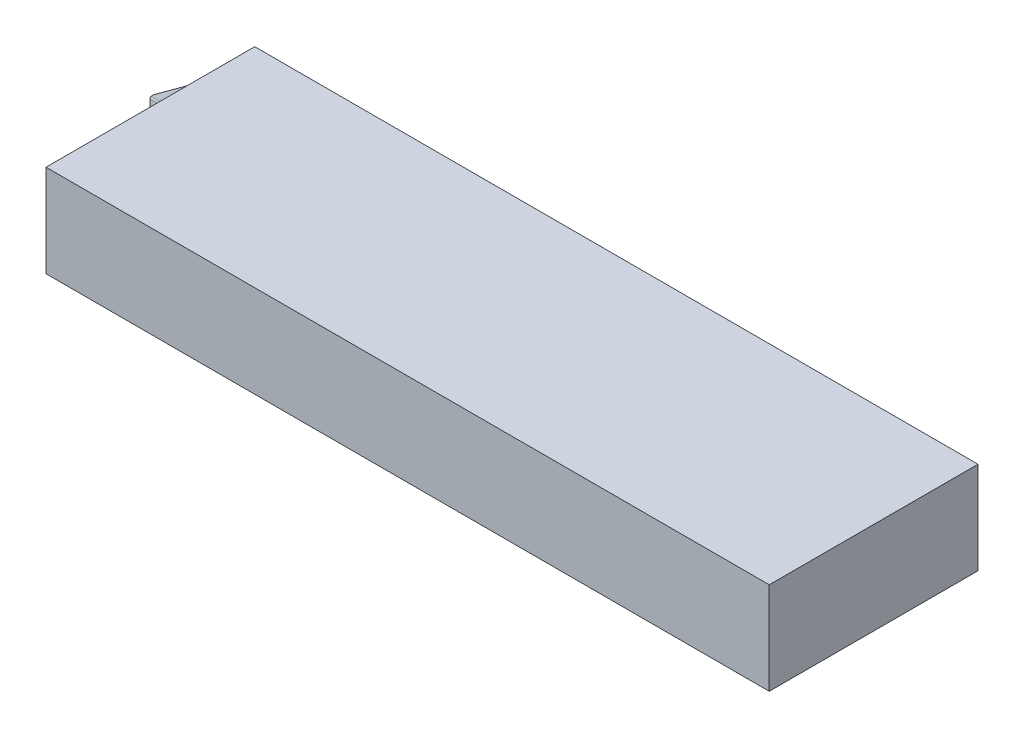
ISO-10303-21;
HEADER;
FILE_DESCRIPTION(('STEP AP214'),'2;1');
FILE_NAME('part.step','',(''),(''),'','','');
FILE_SCHEMA(('AUTOMOTIVE_DESIGN { 1 0 10303 214 1 1 1 1 }'));
ENDSEC;
DATA;
#1=APPLICATION_CONTEXT('core data for automotive mechanical design processes');
#2=APPLICATION_PROTOCOL_DEFINITION('international standard','automotive_design',2000,#1);
#3=PRODUCT_CONTEXT('',#1,'mechanical');
#4=PRODUCT('Part','Part','',(#3));
#5=PRODUCT_RELATED_PRODUCT_CATEGORY('part','',(#4));
#6=PRODUCT_DEFINITION_FORMATION('','',#4);
#7=PRODUCT_DEFINITION_CONTEXT('part definition',#1,'design');
#8=PRODUCT_DEFINITION('design','',#6,#7);
#9=PRODUCT_DEFINITION_SHAPE('','',#8);
#10=(LENGTH_UNIT() NAMED_UNIT(*) SI_UNIT(.MILLI.,.METRE.));
#11=(NAMED_UNIT(*) PLANE_ANGLE_UNIT() SI_UNIT($,.RADIAN.));
#12=(NAMED_UNIT(*) SI_UNIT($,.STERADIAN.) SOLID_ANGLE_UNIT());
#13=UNCERTAINTY_MEASURE_WITH_UNIT(LENGTH_MEASURE(1.E-05),#10,'distance_accuracy_value','');
#14=(GEOMETRIC_REPRESENTATION_CONTEXT(3) GLOBAL_UNCERTAINTY_ASSIGNED_CONTEXT((#13)) GLOBAL_UNIT_ASSIGNED_CONTEXT((#10,
#11,#12)) REPRESENTATION_CONTEXT('',''));
#15=CARTESIAN_POINT('',(0.,0.,0.));
#16=DIRECTION('',(0.,0.,1.));
#17=DIRECTION('',(1.,0.,0.));
#18=AXIS2_PLACEMENT_3D('',#15,#16,#17);
#19=CARTESIAN_POINT('',(-11.,2.8067,-3.175));
#20=DIRECTION('',(1.,0.,0.));
#21=DIRECTION('',(0.,0.,-1.));
#22=AXIS2_PLACEMENT_3D('',#19,#20,#21);
#23=PLANE('',#22);
#24=DIRECTION('',(0.,-1.,0.));
#25=VECTOR('',#24,1.);
#26=CARTESIAN_POINT('',(-11.,1.51822012820513,-0.427690934701181));
#27=LINE('',#26,#25);
#28=CARTESIAN_POINT('',(-11.,2.58602775294961,-0.427690934701183));
#29=VERTEX_POINT('',#28);
#30=CARTESIAN_POINT('',(-11.,2.12708191610956,-0.427690934701182));
#31=VERTEX_POINT('',#30);
#32=EDGE_CURVE('E237',#29,#31,#27,.T.);
#33=ORIENTED_EDGE('',*,*,#32,.T.);
#34=CARTESIAN_POINT('',(-11.,2.14140290911485,-0.370406962680024));
#35=DIRECTION('',(1.,0.,0.));
#36=DIRECTION('',(0.,0.707106781186549,0.707106781186546));
#37=AXIS2_PLACEMENT_3D('',#34,#35,#36);
#38=ELLIPSE('',#37,0.0640454277302532,0.049609375);
#39=CARTESIAN_POINT('',(-11.,2.08411893709369,-0.384727955685313));
#40=VERTEX_POINT('',#39);
#41=EDGE_CURVE('E239',#31,#40,#38,.F.);
#42=ORIENTED_EDGE('',*,*,#41,.T.);
#43=DIRECTION('',(0.,0.,1.));
#44=VECTOR('',#43,1.);
#45=CARTESIAN_POINT('',(-11.,2.08411893709369,1.25));
#46=LINE('',#45,#44);
#47=CARTESIAN_POINT('',(-11.,2.08411893709369,1.77293582987269));
#48=VERTEX_POINT('',#47);
#49=EDGE_CURVE('E461',#40,#48,#46,.T.);
#50=ORIENTED_EDGE('',*,*,#49,.T.);
#51=CARTESIAN_POINT('',(-11.,2.02683496507253,1.7586148368674));
#52=DIRECTION('',(1.,0.,0.));
#53=DIRECTION('',(0.,-0.707106781186548,-0.707106781186547));
#54=AXIS2_PLACEMENT_3D('',#51,#52,#53);
#55=ELLIPSE('',#54,0.0640454277302532,0.049609375);
#56=CARTESIAN_POINT('',(-11.,2.04115595807782,1.81589880888856));
#57=VERTEX_POINT('',#56);
#58=EDGE_CURVE('E221',#48,#57,#55,.T.);
#59=ORIENTED_EDGE('',*,*,#58,.T.);
#60=DIRECTION('',(0.,-1.,0.));
#61=VECTOR('',#60,1.);
#62=CARTESIAN_POINT('',(-11.,1.29386115384615,1.81589880888856));
#63=LINE('',#62,#61);
#64=CARTESIAN_POINT('',(-11.,0.77092532397346,1.81589880888856));
#65=VERTEX_POINT('',#64);
#66=EDGE_CURVE('E191',#57,#65,#63,.T.);
#67=ORIENTED_EDGE('',*,*,#66,.T.);
#68=CARTESIAN_POINT('',(-11.,0.78524631697875,1.75861483686741));
#69=DIRECTION('',(1.,0.,0.));
#70=DIRECTION('',(0.,-0.707106781186547,0.707106781186549));
#71=AXIS2_PLACEMENT_3D('',#68,#69,#70);
#72=ELLIPSE('',#71,0.0640454277302532,0.049609375);
#73=CARTESIAN_POINT('',(-11.,0.727962344957592,1.7729358298727));
#74=VERTEX_POINT('',#73);
#75=EDGE_CURVE('E219',#65,#74,#72,.T.);
#76=ORIENTED_EDGE('',*,*,#75,.T.);
#77=DIRECTION('',(0.,0.,-1.));
#78=VECTOR('',#77,1.);
#79=CARTESIAN_POINT('',(-11.,0.72796234495759,-0.993589743589744));
#80=LINE('',#79,#78);
#81=CARTESIAN_POINT('',(-11.,0.72796234495759,-0.384727955685313));
#82=VERTEX_POINT('',#81);
#83=EDGE_CURVE('E269',#74,#82,#80,.T.);
#84=ORIENTED_EDGE('',*,*,#83,.T.);
#85=CARTESIAN_POINT('',(-11.,0.670678372936433,-0.370406962680024));
#86=DIRECTION('',(1.,0.,0.));
#87=DIRECTION('',(0.,0.707106781186547,-0.707106781186548));
#88=AXIS2_PLACEMENT_3D('',#85,#86,#87);
#89=ELLIPSE('',#88,0.0640454277302532,0.049609375);
#90=CARTESIAN_POINT('',(-11.,0.684999365941722,-0.427690934701181));
#91=VERTEX_POINT('',#90);
#92=EDGE_CURVE('E243',#82,#91,#89,.F.);
#93=ORIENTED_EDGE('',*,*,#92,.T.);
#94=DIRECTION('',(0.,-1.,0.));
#95=VECTOR('',#94,1.);
#96=CARTESIAN_POINT('',(-11.,0.748989358974357,-0.427690934701181));
#97=LINE('',#96,#95);
#98=CARTESIAN_POINT('',(-11.,0.226053529101663,-0.427690934701181));
#99=VERTEX_POINT('',#98);
#100=EDGE_CURVE('E441',#91,#99,#97,.T.);
#101=ORIENTED_EDGE('',*,*,#100,.T.);
#102=CARTESIAN_POINT('',(-11.,0.240374522106953,-0.484974906722339));
#103=DIRECTION('',(1.,0.,0.));
#104=DIRECTION('',(0.,-0.707106781186548,0.707106781186548));
#105=AXIS2_PLACEMENT_3D('',#102,#103,#104);
#106=ELLIPSE('',#105,0.0640454277302532,0.049609375);
#107=CARTESIAN_POINT('',(-11.,0.183090550085795,-0.470653913717049));
#108=VERTEX_POINT('',#107);
#109=EDGE_CURVE('E217',#99,#108,#106,.T.);
#110=ORIENTED_EDGE('',*,*,#109,.T.);
#111=DIRECTION('',(0.,0.,-1.));
#112=VECTOR('',#111,1.);
#113=CARTESIAN_POINT('',(-11.,0.183090550085796,-1.25));
#114=LINE('',#113,#112);
#115=CARTESIAN_POINT('',(-11.,0.183090550085796,-1.77293582987269));
#116=VERTEX_POINT('',#115);
#117=EDGE_CURVE('E446',#108,#116,#114,.T.);
#118=ORIENTED_EDGE('',*,*,#117,.T.);
#119=CARTESIAN_POINT('',(-11.,0.240374522106954,-1.7586148368674));
#120=DIRECTION('',(1.,0.,0.));
#121=DIRECTION('',(0.,-0.707106781186547,-0.707106781186548));
#122=AXIS2_PLACEMENT_3D('',#119,#120,#121);
#123=ELLIPSE('',#122,0.0640454277302532,0.049609375);
#124=CARTESIAN_POINT('',(-11.,0.226053529101664,-1.81589880888856));
#125=VERTEX_POINT('',#124);
#126=EDGE_CURVE('E215',#116,#125,#123,.T.);
#127=ORIENTED_EDGE('',*,*,#126,.T.);
#128=DIRECTION('',(0.,1.,0.));
#129=VECTOR('',#128,1.);
#130=CARTESIAN_POINT('',(-11.,2.06309192307692,-1.81589880888856));
#131=LINE('',#130,#129);
#132=CARTESIAN_POINT('',(-11.,2.58602775294961,-1.81589880888856));
#133=VERTEX_POINT('',#132);
#134=EDGE_CURVE('E230',#125,#133,#131,.T.);
#135=ORIENTED_EDGE('',*,*,#134,.T.);
#136=CARTESIAN_POINT('',(-11.,2.57170675994433,-1.75861483686741));
#137=DIRECTION('',(1.,0.,0.));
#138=DIRECTION('',(0.,-0.707106781186547,0.707106781186548));
#139=AXIS2_PLACEMENT_3D('',#136,#137,#138);
#140=ELLIPSE('',#139,0.0640454277302532,0.049609375);
#141=CARTESIAN_POINT('',(-11.,2.62899073196548,-1.77293582987269));
#142=VERTEX_POINT('',#141);
#143=EDGE_CURVE('E52',#133,#142,#140,.T.);
#144=ORIENTED_EDGE('',*,*,#143,.T.);
#145=DIRECTION('',(0.,0.,1.));
#146=VECTOR('',#145,1.);
#147=CARTESIAN_POINT('',(-11.,2.62899073196548,-0.993589743589744));
#148=LINE('',#147,#146);
#149=CARTESIAN_POINT('',(-11.,2.62899073196548,-0.470653913717051));
#150=VERTEX_POINT('',#149);
#151=EDGE_CURVE('E227',#142,#150,#148,.T.);
#152=ORIENTED_EDGE('',*,*,#151,.T.);
#153=CARTESIAN_POINT('',(-11.,2.57170675994433,-0.484974906722341));
#154=DIRECTION('',(1.,0.,0.));
#155=DIRECTION('',(0.,-0.707106781186548,-0.707106781186547));
#156=AXIS2_PLACEMENT_3D('',#153,#154,#155);
#157=ELLIPSE('',#156,0.0640454277302532,0.049609375);
#158=EDGE_CURVE('E208',#150,#29,#157,.T.);
#159=ORIENTED_EDGE('',*,*,#158,.T.);
#160=EDGE_LOOP('',(#33,#42,#50,#59,#67,#76,#84,#93,#101,#110,#118,#127,#135,#144,#152,#159));
#161=FACE_BOUND('',#160,.T.);
#162=DIRECTION('',(0.,0.,1.));
#163=VECTOR('',#162,1.);
#164=CARTESIAN_POINT('',(-11.,0.,-3.175));
#165=LINE('',#164,#163);
#166=CARTESIAN_POINT('',(-11.,0.,-3.175));
#167=VERTEX_POINT('',#166);
#168=CARTESIAN_POINT('',(-11.,0.,3.175));
#169=VERTEX_POINT('',#168);
#170=EDGE_CURVE('E494',#167,#169,#165,.T.);
#171=ORIENTED_EDGE('',*,*,#170,.T.);
#172=DIRECTION('',(0.,-1.,0.));
#173=VECTOR('',#172,1.);
#174=CARTESIAN_POINT('',(-11.,2.8067,3.175));
#175=LINE('',#174,#173);
#176=CARTESIAN_POINT('',(-11.,2.8067,3.175));
#177=VERTEX_POINT('',#176);
#178=EDGE_CURVE('E499',#177,#169,#175,.T.);
#179=ORIENTED_EDGE('',*,*,#178,.F.);
#180=DIRECTION('',(0.,0.,1.));
#181=VECTOR('',#180,1.);
#182=CARTESIAN_POINT('',(-11.,2.8067,-3.175));
#183=LINE('',#182,#181);
#184=CARTESIAN_POINT('',(-11.,2.8067,-3.175));
#185=VERTEX_POINT('',#184);
#186=EDGE_CURVE('E488',#185,#177,#183,.T.);
#187=ORIENTED_EDGE('',*,*,#186,.F.);
#188=DIRECTION('',(0.,-1.,0.));
#189=VECTOR('',#188,1.);
#190=CARTESIAN_POINT('',(-11.,2.8067,-3.175));
#191=LINE('',#190,#189);
#192=EDGE_CURVE('E502',#185,#167,#191,.T.);
#193=ORIENTED_EDGE('',*,*,#192,.T.);
#194=EDGE_LOOP('',(#171,#179,#187,#193));
#195=FACE_BOUND('',#194,.T.);
#196=ADVANCED_FACE('F38',(#161,#195),#23,.F.);
#197=CARTESIAN_POINT('',(11.,2.8067,-3.175));
#198=DIRECTION('',(-1.,0.,0.));
#199=DIRECTION('',(0.,0.,1.));
#200=AXIS2_PLACEMENT_3D('',#197,#198,#199);
#201=PLANE('',#200);
#202=DIRECTION('',(0.,0.,-1.));
#203=VECTOR('',#202,1.);
#204=CARTESIAN_POINT('',(11.,0.,-3.175));
#205=LINE('',#204,#203);
#206=CARTESIAN_POINT('',(11.,0.,3.175));
#207=VERTEX_POINT('',#206);
#208=CARTESIAN_POINT('',(11.,0.,-3.175));
#209=VERTEX_POINT('',#208);
#210=EDGE_CURVE('E473',#207,#209,#205,.T.);
#211=ORIENTED_EDGE('',*,*,#210,.T.);
#212=DIRECTION('',(0.,-1.,0.));
#213=VECTOR('',#212,1.);
#214=CARTESIAN_POINT('',(11.,2.8067,-3.175));
#215=LINE('',#214,#213);
#216=CARTESIAN_POINT('',(11.,2.8067,-3.175));
#217=VERTEX_POINT('',#216);
#218=EDGE_CURVE('E505',#217,#209,#215,.T.);
#219=ORIENTED_EDGE('',*,*,#218,.F.);
#220=DIRECTION('',(0.,0.,-1.));
#221=VECTOR('',#220,1.);
#222=CARTESIAN_POINT('',(11.,2.8067,-3.175));
#223=LINE('',#222,#221);
#224=CARTESIAN_POINT('',(11.,2.8067,3.175));
#225=VERTEX_POINT('',#224);
#226=EDGE_CURVE('E482',#225,#217,#223,.T.);
#227=ORIENTED_EDGE('',*,*,#226,.F.);
#228=DIRECTION('',(0.,-1.,0.));
#229=VECTOR('',#228,1.);
#230=CARTESIAN_POINT('',(11.,2.8067,3.175));
#231=LINE('',#230,#229);
#232=EDGE_CURVE('E491',#225,#207,#231,.T.);
#233=ORIENTED_EDGE('',*,*,#232,.T.);
#234=EDGE_LOOP('',(#211,#219,#227,#233));
#235=FACE_BOUND('',#234,.T.);
#236=ADVANCED_FACE('F347',(#235),#201,.F.);
#237=CARTESIAN_POINT('',(11.,2.8067,-3.175));
#238=DIRECTION('',(0.,0.,1.));
#239=DIRECTION('',(1.,0.,0.));
#240=AXIS2_PLACEMENT_3D('',#237,#238,#239);
#241=PLANE('',#240);
#242=DIRECTION('',(-1.,0.,0.));
#243=VECTOR('',#242,1.);
#244=CARTESIAN_POINT('',(11.,0.,-3.175));
#245=LINE('',#244,#243);
#246=EDGE_CURVE('E475',#209,#167,#245,.T.);
#247=ORIENTED_EDGE('',*,*,#246,.T.);
#248=ORIENTED_EDGE('',*,*,#192,.F.);
#249=DIRECTION('',(-1.,0.,0.));
#250=VECTOR('',#249,1.);
#251=CARTESIAN_POINT('',(11.,2.8067,-3.175));
#252=LINE('',#251,#250);
#253=EDGE_CURVE('E485',#217,#185,#252,.T.);
#254=ORIENTED_EDGE('',*,*,#253,.F.);
#255=ORIENTED_EDGE('',*,*,#218,.T.);
#256=EDGE_LOOP('',(#247,#248,#254,#255));
#257=FACE_BOUND('',#256,.T.);
#258=ADVANCED_FACE('F352',(#257),#241,.F.);
#259=CARTESIAN_POINT('',(11.,2.8067,3.175));
#260=DIRECTION('',(0.,0.,-1.));
#261=DIRECTION('',(-1.,0.,0.));
#262=AXIS2_PLACEMENT_3D('',#259,#260,#261);
#263=PLANE('',#262);
#264=DIRECTION('',(1.,0.,0.));
#265=VECTOR('',#264,1.);
#266=CARTESIAN_POINT('',(11.,0.,3.175));
#267=LINE('',#266,#265);
#268=EDGE_CURVE('E486',#169,#207,#267,.T.);
#269=ORIENTED_EDGE('',*,*,#268,.T.);
#270=ORIENTED_EDGE('',*,*,#232,.F.);
#271=DIRECTION('',(1.,0.,0.));
#272=VECTOR('',#271,1.);
#273=CARTESIAN_POINT('',(11.,2.8067,3.175));
#274=LINE('',#273,#272);
#275=EDGE_CURVE('E490',#177,#225,#274,.T.);
#276=ORIENTED_EDGE('',*,*,#275,.F.);
#277=ORIENTED_EDGE('',*,*,#178,.T.);
#278=EDGE_LOOP('',(#269,#270,#276,#277));
#279=FACE_BOUND('',#278,.T.);
#280=ADVANCED_FACE('F357',(#279),#263,.F.);
#281=CARTESIAN_POINT('',(0.,2.8067,0.));
#282=DIRECTION('',(0.,-1.,0.));
#283=DIRECTION('',(0.,0.,-1.));
#284=AXIS2_PLACEMENT_3D('',#281,#282,#283);
#285=PLANE('',#284);
#286=ORIENTED_EDGE('',*,*,#226,.T.);
#287=ORIENTED_EDGE('',*,*,#253,.T.);
#288=ORIENTED_EDGE('',*,*,#186,.T.);
#289=ORIENTED_EDGE('',*,*,#275,.T.);
#290=EDGE_LOOP('',(#286,#287,#288,#289));
#291=FACE_BOUND('',#290,.T.);
#292=ADVANCED_FACE('F291',(#291),#285,.F.);
#293=CARTESIAN_POINT('',(0.,0.,0.));
#294=DIRECTION('',(0.,-1.,0.));
#295=DIRECTION('',(0.,0.,-1.));
#296=AXIS2_PLACEMENT_3D('',#293,#294,#295);
#297=PLANE('',#296);
#298=ORIENTED_EDGE('',*,*,#210,.F.);
#299=ORIENTED_EDGE('',*,*,#268,.F.);
#300=ORIENTED_EDGE('',*,*,#170,.F.);
#301=ORIENTED_EDGE('',*,*,#246,.F.);
#302=EDGE_LOOP('',(#298,#299,#300,#301));
#303=FACE_BOUND('',#302,.T.);
#304=ADVANCED_FACE('F410',(#303),#297,.T.);
#305=CARTESIAN_POINT('',(-12.0780205827676,2.06309192307692,-1.19350333523574));
#306=DIRECTION('',(0.500000000000005,0.,0.866025403784436));
#307=DIRECTION('',(0.,-1.,0.));
#308=AXIS2_PLACEMENT_3D('',#305,#306,#307);
#309=PLANE('',#308);
#310=ORIENTED_EDGE('',*,*,#134,.F.);
#311=DIRECTION('',(0.774596669241479,-0.447213595499961,-0.447213595499962));
#312=VECTOR('',#311,1.);
#313=CARTESIAN_POINT('',(-12.498785232978,1.09137758681898,-0.95057475117125));
#314=LINE('',#313,#312);
#315=CARTESIAN_POINT('',(-12.07696,0.847836675008121,-1.1941156629821));
#316=VERTEX_POINT('',#315);
#317=EDGE_CURVE('E253',#125,#316,#314,.F.);
#318=ORIENTED_EDGE('',*,*,#317,.T.);
#319=DIRECTION('',(0.,-1.,0.));
#320=VECTOR('',#319,1.);
#321=CARTESIAN_POINT('',(-12.07696,2.06309192307692,-1.1941156629821));
#322=LINE('',#321,#320);
#323=CARTESIAN_POINT('',(-12.07696,1.96424460704316,-1.19411566298211));
#324=VERTEX_POINT('',#323);
#325=EDGE_CURVE('E190',#324,#316,#322,.T.);
#326=ORIENTED_EDGE('',*,*,#325,.F.);
#327=DIRECTION('',(-0.774596669241479,-0.447213595499961,0.447213595499962));
#328=VECTOR('',#327,1.);
#329=CARTESIAN_POINT('',(-12.0435667515016,1.98352420805282,-1.21339526399177));
#330=LINE('',#329,#328);
#331=EDGE_CURVE('E251',#324,#133,#330,.F.);
#332=ORIENTED_EDGE('',*,*,#331,.T.);
#333=EDGE_LOOP('',(#310,#318,#326,#332));
#334=FACE_BOUND('',#333,.T.);
#335=ADVANCED_FACE('F405',(#334),#309,.F.);
#336=CARTESIAN_POINT('',(-12.0780205827676,0.805486023738616,-1.25));
#337=DIRECTION('',(0.500000000000005,0.866025403784436,0.));
#338=DIRECTION('',(0.,0.,1.));
#339=AXIS2_PLACEMENT_3D('',#336,#337,#338);
#340=PLANE('',#339);
#341=DIRECTION('',(0.774596669241479,-0.447213595499962,0.447213595499962));
#342=VECTOR('',#341,1.);
#343=CARTESIAN_POINT('',(-12.1323898698385,0.836876146264642,-1.1244395098959));
#344=LINE('',#343,#342);
#345=CARTESIAN_POINT('',(-12.0562747319261,0.792931050901548,-1.0804944145328));
#346=VERTEX_POINT('',#345);
#347=EDGE_CURVE('E241',#108,#346,#344,.F.);
#348=ORIENTED_EDGE('',*,*,#347,.T.);
#349=CARTESIAN_POINT('',(-18.3136728989092,4.40564156703596,0.));
#350=DIRECTION('',(0.500000000000005,0.866025403784436,0.));
#351=DIRECTION('',(0.866025403784436,-0.500000000000005,0.));
#352=AXIS2_PLACEMENT_3D('',#349,#350,#351);
#353=ELLIPSE('',#352,7.33234841870827,6.35);
#354=CARTESIAN_POINT('',(-12.0696651203595,0.800661995268129,-1.15536438469036));
#355=VERTEX_POINT('',#354);
#356=EDGE_CURVE('E330',#346,#355,#353,.T.);
#357=ORIENTED_EDGE('',*,*,#356,.T.);
#358=DIRECTION('',(0.774596669241479,-0.447213595499961,-0.447213595499962));
#359=VECTOR('',#358,1.);
#360=CARTESIAN_POINT('',(-12.0435667515016,0.78559409498259,-1.1704322849759));
#361=LINE('',#360,#359);
#362=EDGE_CURVE('E249',#355,#116,#361,.T.);
#363=ORIENTED_EDGE('',*,*,#362,.T.);
#364=ORIENTED_EDGE('',*,*,#117,.F.);
#365=EDGE_LOOP('',(#348,#357,#363,#364));
#366=FACE_BOUND('',#365,.T.);
#367=ADVANCED_FACE('F399',(#366),#340,.F.);
#368=CARTESIAN_POINT('',(-12.0780205827676,2.00659525831266,-0.993589743589744));
#369=DIRECTION('',(0.500000000000005,-0.866025403784436,0.));
#370=DIRECTION('',(0.,0.,-1.));
#371=AXIS2_PLACEMENT_3D('',#368,#369,#370);
#372=PLANE('',#371);
#373=DIRECTION('',(-0.774596669241479,-0.447213595499961,0.447213595499962));
#374=VECTOR('',#373,1.);
#375=CARTESIAN_POINT('',(-12.1323898698385,1.97520513578664,-1.11915023369385));
#376=LINE('',#375,#374);
#377=CARTESIAN_POINT('',(-12.0696651203595,2.01141928678315,-1.15536438469036));
#378=VERTEX_POINT('',#377);
#379=EDGE_CURVE('E236',#142,#378,#376,.T.);
#380=ORIENTED_EDGE('',*,*,#379,.T.);
#381=CARTESIAN_POINT('',(-18.3136728989092,-1.59356028498469,0.));
#382=DIRECTION('',(0.500000000000005,-0.866025403784436,0.));
#383=DIRECTION('',(-0.866025403784436,-0.500000000000005,0.));
#384=AXIS2_PLACEMENT_3D('',#381,#382,#383);
#385=ELLIPSE('',#384,7.33234841870827,6.35);
#386=CARTESIAN_POINT('',(-12.0562747319261,2.01915023114973,-1.0804944145328));
#387=VERTEX_POINT('',#386);
#388=EDGE_CURVE('E58',#378,#387,#385,.T.);
#389=ORIENTED_EDGE('',*,*,#388,.T.);
#390=DIRECTION('',(-0.77459666924148,-0.447213595499962,-0.447213595499961));
#391=VECTOR('',#390,1.);
#392=CARTESIAN_POINT('',(-12.0435667515016,2.02648718706869,-1.07315745861385));
#393=LINE('',#392,#391);
#394=EDGE_CURVE('E65',#387,#150,#393,.F.);
#395=ORIENTED_EDGE('',*,*,#394,.T.);
#396=ORIENTED_EDGE('',*,*,#151,.F.);
#397=EDGE_LOOP('',(#380,#389,#395,#396));
#398=FACE_BOUND('',#397,.T.);
#399=ADVANCED_FACE('F235',(#398),#372,.F.);
#400=CARTESIAN_POINT('',(-12.0780205827676,0.748989358974357,-1.050086408354));
#401=DIRECTION('',(0.500000000000005,0.,-0.866025403784436));
#402=DIRECTION('',(0.,1.,0.));
#403=AXIS2_PLACEMENT_3D('',#400,#401,#402);
#404=PLANE('',#403);
#405=DIRECTION('',(0.774596669241479,-0.447213595499961,0.447213595499962));
#406=VECTOR('',#405,1.);
#407=CARTESIAN_POINT('',(-12.0918428125,1.31537510765135,-1.05806667641081));
#408=LINE('',#407,#406);
#409=CARTESIAN_POINT('',(-12.0482414547626,1.29020185202465,-1.03289342078411));
#410=VERTEX_POINT('',#409);
#411=EDGE_CURVE('E256',#91,#410,#408,.F.);
#412=ORIENTED_EDGE('',*,*,#411,.T.);
#413=DIRECTION('',(0.,-1.,0.));
#414=VECTOR('',#413,1.);
#415=CARTESIAN_POINT('',(-12.0482414547626,2.8067,-1.03289342078411));
#416=LINE('',#415,#414);
#417=CARTESIAN_POINT('',(-12.0482414547626,0.831256015184596,-1.03289342078411));
#418=VERTEX_POINT('',#417);
#419=EDGE_CURVE('E331',#410,#418,#416,.T.);
#420=ORIENTED_EDGE('',*,*,#419,.T.);
#421=DIRECTION('',(0.774596669241479,-0.447213595499961,0.447213595499962));
#422=VECTOR('',#421,1.);
#423=CARTESIAN_POINT('',(-12.0435667515016,0.828557073998458,-1.03019447959798));
#424=LINE('',#423,#422);
#425=EDGE_CURVE('E259',#418,#99,#424,.T.);
#426=ORIENTED_EDGE('',*,*,#425,.T.);
#427=ORIENTED_EDGE('',*,*,#100,.F.);
#428=EDGE_LOOP('',(#412,#420,#426,#427));
#429=FACE_BOUND('',#428,.T.);
#430=ADVANCED_FACE('F386',(#429),#404,.F.);
#431=CARTESIAN_POINT('',(-12.0780205827676,1.51822012820513,-1.050086408354));
#432=DIRECTION('',(0.500000000000005,0.,-0.866025403784436));
#433=DIRECTION('',(0.,1.,0.));
#434=AXIS2_PLACEMENT_3D('',#431,#432,#433);
#435=PLANE('',#434);
#436=DIRECTION('',(-0.774596669241479,-0.447213595499962,-0.447213595499961));
#437=VECTOR('',#436,1.);
#438=CARTESIAN_POINT('',(-12.2323158779674,1.87454984907846,-1.13916883857234));
#439=LINE('',#438,#437);
#440=CARTESIAN_POINT('',(-12.0482414547626,1.98082526686668,-1.03289342078411));
#441=VERTEX_POINT('',#440);
#442=EDGE_CURVE('E426',#29,#441,#439,.T.);
#443=ORIENTED_EDGE('',*,*,#442,.T.);
#444=DIRECTION('',(0.,-1.,0.));
#445=VECTOR('',#444,1.);
#446=CARTESIAN_POINT('',(-12.0482414547626,2.80669999999999,-1.03289342078412));
#447=LINE('',#446,#445);
#448=CARTESIAN_POINT('',(-12.0482414547626,1.52187943002662,-1.03289342078411));
#449=VERTEX_POINT('',#448);
#450=EDGE_CURVE('E427',#441,#449,#447,.T.);
#451=ORIENTED_EDGE('',*,*,#450,.T.);
#452=DIRECTION('',(-0.774596669241479,-0.447213595499962,-0.447213595499961));
#453=VECTOR('',#452,1.);
#454=CARTESIAN_POINT('',(-11.0148828125,2.11848932030638,-0.436283530504356));
#455=LINE('',#454,#453);
#456=EDGE_CURVE('E431',#449,#31,#455,.F.);
#457=ORIENTED_EDGE('',*,*,#456,.T.);
#458=ORIENTED_EDGE('',*,*,#32,.F.);
#459=EDGE_LOOP('',(#443,#451,#457,#458));
#460=FACE_BOUND('',#459,.T.);
#461=ADVANCED_FACE('F380',(#460),#435,.F.);
#462=CARTESIAN_POINT('',(-12.0780205827676,1.35035781861041,-0.993589743589743));
#463=DIRECTION('',(0.500000000000005,0.866025403784436,0.));
#464=DIRECTION('',(0.,0.,1.));
#465=AXIS2_PLACEMENT_3D('',#462,#463,#464);
#466=PLANE('',#465);
#467=DIRECTION('',(0.774596669241479,-0.447213595499961,0.447213595499962));
#468=VECTOR('',#467,1.);
#469=CARTESIAN_POINT('',(-12.8207690369492,1.77918383857234,0.721714336257943));
#470=LINE('',#469,#468);
#471=CARTESIAN_POINT('',(-12.0696651203595,1.34553379013993,1.15536438469035));
#472=VERTEX_POINT('',#471);
#473=EDGE_CURVE('E210',#74,#472,#470,.F.);
#474=ORIENTED_EDGE('',*,*,#473,.T.);
#475=CARTESIAN_POINT('',(-18.3136728989092,4.95051336190776,0.));
#476=DIRECTION('',(0.500000000000005,0.866025403784436,0.));
#477=DIRECTION('',(0.866025403784436,-0.500000000000005,0.));
#478=AXIS2_PLACEMENT_3D('',#475,#476,#477);
#479=ELLIPSE('',#478,7.33234841870827,6.35);
#480=CARTESIAN_POINT('',(-12.0406167070337,1.32876268088674,-0.985528291614462));
#481=VERTEX_POINT('',#480);
#482=EDGE_CURVE('E266',#472,#481,#479,.T.);
#483=ORIENTED_EDGE('',*,*,#482,.T.);
#484=DIRECTION('',(0.774596669241479,-0.447213595499961,0.447213595499962));
#485=VECTOR('',#484,1.);
#486=CARTESIAN_POINT('',(-11.0148828125,0.736554940760764,-0.393320551488487));
#487=LINE('',#486,#485);
#488=EDGE_CURVE('E206',#481,#82,#487,.T.);
#489=ORIENTED_EDGE('',*,*,#488,.T.);
#490=ORIENTED_EDGE('',*,*,#83,.F.);
#491=EDGE_LOOP('',(#474,#483,#489,#490));
#492=FACE_BOUND('',#491,.T.);
#493=ADVANCED_FACE('F265',(#492),#466,.F.);
#494=CARTESIAN_POINT('',(-12.0780205827676,1.46172346344087,1.25));
#495=DIRECTION('',(0.500000000000005,-0.866025403784436,0.));
#496=DIRECTION('',(0.,0.,-1.));
#497=AXIS2_PLACEMENT_3D('',#494,#495,#496);
#498=PLANE('',#497);
#499=DIRECTION('',(-0.774596669241479,-0.447213595499962,-0.447213595499961));
#500=VECTOR('',#499,1.);
#501=CARTESIAN_POINT('',(-12.0918428125,1.45374319538405,-1.01510369739494));
#502=LINE('',#501,#500);
#503=CARTESIAN_POINT('',(-12.0406167070337,1.48331860116454,-0.985528291614462));
#504=VERTEX_POINT('',#503);
#505=EDGE_CURVE('E432',#40,#504,#502,.T.);
#506=ORIENTED_EDGE('',*,*,#505,.T.);
#507=CARTESIAN_POINT('',(-18.3136728989092,-2.13843207985648,0.));
#508=DIRECTION('',(0.500000000000005,-0.866025403784436,0.));
#509=DIRECTION('',(-0.866025403784436,-0.500000000000005,0.));
#510=AXIS2_PLACEMENT_3D('',#507,#508,#509);
#511=ELLIPSE('',#510,7.33234841870827,6.35);
#512=CARTESIAN_POINT('',(-12.0696651203595,1.46654749191135,1.15536438469035));
#513=VERTEX_POINT('',#512);
#514=EDGE_CURVE('E200',#504,#513,#511,.T.);
#515=ORIENTED_EDGE('',*,*,#514,.T.);
#516=DIRECTION('',(-0.774596669241479,-0.447213595499962,-0.447213595499961));
#517=VECTOR('',#516,1.);
#518=CARTESIAN_POINT('',(-12.0435667515016,1.4816153921969,1.1704322849759));
#519=LINE('',#518,#517);
#520=EDGE_CURVE('E199',#513,#48,#519,.F.);
#521=ORIENTED_EDGE('',*,*,#520,.T.);
#522=ORIENTED_EDGE('',*,*,#49,.F.);
#523=EDGE_LOOP('',(#506,#515,#521,#522));
#524=FACE_BOUND('',#523,.T.);
#525=ADVANCED_FACE('F368',(#524),#498,.F.);
#526=CARTESIAN_POINT('',(-12.0780205827676,1.29386115384615,1.19350333523574));
#527=DIRECTION('',(0.500000000000005,0.,-0.866025403784436));
#528=DIRECTION('',(0.,1.,0.));
#529=AXIS2_PLACEMENT_3D('',#526,#527,#528);
#530=PLANE('',#529);
#531=DIRECTION('',(0.,1.,0.));
#532=VECTOR('',#531,1.);
#533=CARTESIAN_POINT('',(-12.07696,1.29386115384615,1.1941156629821));
#534=LINE('',#533,#532);
#535=CARTESIAN_POINT('',(-12.07696,1.39270846987993,1.1941156629821));
#536=VERTEX_POINT('',#535);
#537=CARTESIAN_POINT('',(-12.07696,1.41937281217135,1.1941156629821));
#538=VERTEX_POINT('',#537);
#539=EDGE_CURVE('E179',#536,#538,#534,.T.);
#540=ORIENTED_EDGE('',*,*,#539,.F.);
#541=DIRECTION('',(0.774596669241479,-0.447213595499961,0.447213595499962));
#542=VECTOR('',#541,1.);
#543=CARTESIAN_POINT('',(-12.0435667515016,1.37342886887025,1.21339526399177));
#544=LINE('',#543,#542);
#545=EDGE_CURVE('E205',#536,#65,#544,.T.);
#546=ORIENTED_EDGE('',*,*,#545,.T.);
#547=ORIENTED_EDGE('',*,*,#66,.F.);
#548=DIRECTION('',(-0.774596669241479,-0.447213595499962,-0.447213595499961));
#549=VECTOR('',#548,1.);
#550=CARTESIAN_POINT('',(-12.1212869800463,1.39378061830923,1.16852346911997));
#551=LINE('',#550,#549);
#552=EDGE_CURVE('E198',#57,#538,#551,.T.);
#553=ORIENTED_EDGE('',*,*,#552,.T.);
#554=EDGE_LOOP('',(#540,#546,#547,#553));
#555=FACE_BOUND('',#554,.T.);
#556=ADVANCED_FACE('F203',(#555),#530,.F.);
#557=CARTESIAN_POINT('',(-11.320934778554,1.95611112832437,-0.5556987434705));
#558=DIRECTION('',(0.774596669241479,0.447213595499962,0.447213595499961));
#559=DIRECTION('',(-0.500000000000006,0.866025403784435,0.));
#560=AXIS2_PLACEMENT_3D('',#557,#558,#559);
#561=CYLINDRICAL_SURFACE('',#560,0.049609375);
#562=ORIENTED_EDGE('',*,*,#456,.F.);
#563=CARTESIAN_POINT('',(-12.0482414547626,1.52187943002662,-1.03289342078411));
#564=CARTESIAN_POINT('',(-12.0482418103494,1.51971846290149,-1.03289539018856));
#565=CARTESIAN_POINT('',(-12.0482176952999,1.51755131943355,-1.03274928265581));
#566=CARTESIAN_POINT('',(-12.0481159097295,1.51325301523781,-1.03213168973213));
#567=CARTESIAN_POINT('',(-12.0480379232383,1.51112214320881,-1.03165828464051));
#568=CARTESIAN_POINT('',(-12.0478230718498,1.50696011052957,-1.03035253943994));
#569=CARTESIAN_POINT('',(-12.0476858795561,1.50492957534916,-1.02951820339126));
#570=CARTESIAN_POINT('',(-12.0473535595159,1.50106647750524,-1.02749354454615));
#571=CARTESIAN_POINT('',(-12.0471586169306,1.49923330727313,-1.02630435939334));
#572=CARTESIAN_POINT('',(-12.046735648102,1.49597331971459,-1.02371824800203));
#573=CARTESIAN_POINT('',(-12.046511794097,1.49452527730194,-1.02234727244607));
#574=CARTESIAN_POINT('',(-12.0460288488631,1.49188457399199,-1.01938232026249));
#575=CARTESIAN_POINT('',(-12.0457697266082,1.49069214036295,-1.01778814724882));
#576=CARTESIAN_POINT('',(-12.0452274359783,1.48858362721635,-1.01444286718768));
#577=CARTESIAN_POINT('',(-12.0449443908331,1.48766623033847,-1.0126925620853));
#578=CARTESIAN_POINT('',(-12.0443619898843,1.48609396763748,-1.0090808117714));
#579=CARTESIAN_POINT('',(-12.0440626232374,1.485439278822,-1.00721929259299));
#580=CARTESIAN_POINT('',(-12.0433024621311,1.48410944035734,-1.00247835382091));
#581=CARTESIAN_POINT('',(-12.0428359857019,1.48358860599353,-0.999556527572499));
#582=CARTESIAN_POINT('',(-12.0419007673766,1.48302841695596,-0.993671595556005));
#583=CARTESIAN_POINT('',(-12.0414320247225,1.48298923635338,-0.990708475251418));
#584=CARTESIAN_POINT('',(-12.0408503475149,1.48319646885194,-0.987014599085152));
#585=CARTESIAN_POINT('',(-12.0407333452901,1.48325130228248,-0.98627072358485));
#586=CARTESIAN_POINT('',(-12.0406167070337,1.48331860116454,-0.985528291614461));
#587=B_SPLINE_CURVE_WITH_KNOTS('',3,(#563,#564,#565,#566,#567,#568,#569,#570,#571,#572,#573,
#574,#575,#576,#577,#578,#579,#580,#581,#582,#583,#584,#585,#586),.UNSPECIFIED.,.F.,.F.,(4,2,2,
2,2,2,2,2,2,2,2,4),(0.,0.00648712124098412,0.0130126178642479,0.0195746711012983,
0.0261159084351633,0.0321059249509386,0.0381012454524463,0.0440673733487283,0.0500375143842848,
0.0590009367318258,0.0679675983932855,0.0702320444831779),.UNSPECIFIED.);
#588=EDGE_CURVE('E309',#449,#504,#587,.T.);
#589=ORIENTED_EDGE('',*,*,#588,.T.);
#590=ORIENTED_EDGE('',*,*,#505,.F.);
#591=ORIENTED_EDGE('',*,*,#41,.F.);
#592=EDGE_LOOP('',(#562,#589,#590,#591));
#593=FACE_BOUND('',#592,.T.);
#594=ADVANCED_FACE('F367',(#593),#561,.F.);
#595=CARTESIAN_POINT('',(-12.2075111904674,1.87454984907846,-1.18213181758821));
#596=DIRECTION('',(-0.774596669241479,-0.447213595499962,-0.447213595499961));
#597=DIRECTION('',(0.500000000000005,-0.866025403784436,0.));
#598=AXIS2_PLACEMENT_3D('',#595,#596,#597);
#599=CYLINDRICAL_SURFACE('',#598,0.049609375);
#600=CARTESIAN_POINT('',(-12.0482414547626,1.98082526686668,-1.03289342078411));
#601=CARTESIAN_POINT('',(-12.0482411737345,1.98298053062209,-1.03289153021585));
#602=CARTESIAN_POINT('',(-12.048265095834,1.98514196910957,-1.03303680974624));
#603=CARTESIAN_POINT('',(-12.0483664024377,1.98942966658147,-1.03365115628952));
#604=CARTESIAN_POINT('',(-12.0484441139476,1.9915556284865,-1.03412220375095));
#605=CARTESIAN_POINT('',(-12.0486587797819,1.99570855236657,-1.03542189199079));
#606=CARTESIAN_POINT('',(-12.0487960647658,1.99773489045829,-1.03625252858777));
#607=CARTESIAN_POINT('',(-12.0491299745802,2.00159001838483,-1.03826922752848));
#608=CARTESIAN_POINT('',(-12.0493264055179,2.00341942758833,-1.03945412843045));
#609=CARTESIAN_POINT('',(-12.0497545372591,2.0066701923001,-1.04203085535944));
#610=CARTESIAN_POINT('',(-12.0499818020617,2.00811304137504,-1.04339641974096));
#611=CARTESIAN_POINT('',(-12.050474575093,2.01074282852936,-1.04635032148636));
#612=CARTESIAN_POINT('',(-12.0507401169362,2.01192953936028,-1.04793885462544));
#613=CARTESIAN_POINT('',(-12.0512974733617,2.01402070220191,-1.05126440065436));
#614=CARTESIAN_POINT('',(-12.0515890112629,2.01492775445286,-1.05299984179261));
#615=CARTESIAN_POINT('',(-12.0521920655543,2.01648097397488,-1.05657989808618));
#616=CARTESIAN_POINT('',(-12.0525035941333,2.0171269802963,-1.05842457979345));
#617=CARTESIAN_POINT('',(-12.0533007074545,2.01844042071575,-1.06313132602852));
#618=CARTESIAN_POINT('',(-12.0537945029555,2.01895285287314,-1.06603528505836));
#619=CARTESIAN_POINT('',(-12.0547930303732,2.01949961518594,-1.07188228007619));
#620=CARTESIAN_POINT('',(-12.055297769067,2.01953364006636,-1.074825339816));
#621=CARTESIAN_POINT('',(-12.055959778861,2.01931321163828,-1.07866926662886));
#622=CARTESIAN_POINT('',(-12.05611735839,2.01924101034296,-1.07958304136796));
#623=CARTESIAN_POINT('',(-12.0562747319261,2.01915023114973,-1.0804944145328));
#624=B_SPLINE_CURVE_WITH_KNOTS('',3,(#600,#601,#602,#603,#604,#605,#606,#607,#608,#609,#610,
#611,#612,#613,#614,#615,#616,#617,#618,#619,#620,#621,#622,#623),.UNSPECIFIED.,.F.,.F.,(4,2,2,
2,2,2,2,2,2,2,2,4),(0.,0.00647006407320703,0.0129798115491459,0.0195261626881419,
0.0260512829180586,0.0320199781037299,0.037993947205353,0.0439105679802814,0.0498308311426201,
0.0587508970075489,0.067676654570031,0.070465756945371),.UNSPECIFIED.);
#625=EDGE_CURVE('E299',#441,#387,#624,.T.);
#626=ORIENTED_EDGE('',*,*,#625,.F.);
#627=ORIENTED_EDGE('',*,*,#442,.F.);
#628=ORIENTED_EDGE('',*,*,#158,.F.);
#629=ORIENTED_EDGE('',*,*,#394,.F.);
#630=EDGE_LOOP('',(#626,#627,#628,#629));
#631=FACE_BOUND('',#630,.T.);
#632=ADVANCED_FACE('F414',(#631),#599,.T.);
#633=CARTESIAN_POINT('',(-12.0187620640016,0.828557073998459,-1.1704322849759));
#634=DIRECTION('',(0.774596669241479,-0.447213595499961,-0.447213595499962));
#635=DIRECTION('',(-0.500000000000005,0.,-0.866025403784436));
#636=AXIS2_PLACEMENT_3D('',#633,#634,#635);
#637=CYLINDRICAL_SURFACE('',#636,0.049609375);
#638=CARTESIAN_POINT('',(-12.07696,0.847836675008122,-1.1941156629821));
#639=CARTESIAN_POINT('',(-12.0769603742402,0.844929664026877,-1.19411730689939));
#640=CARTESIAN_POINT('',(-12.0769192827342,0.842016329778499,-1.19390298123376));
#641=CARTESIAN_POINT('',(-12.076749642714,0.836243218866067,-1.19301664242616));
#642=CARTESIAN_POINT('',(-12.0766204962387,0.833383946642617,-1.1923414999491));
#643=CARTESIAN_POINT('',(-12.0762692987333,0.827814667840349,-1.19050289962259));
#644=CARTESIAN_POINT('',(-12.0760468240764,0.825105406468928,-1.18933721507275));
#645=CARTESIAN_POINT('',(-12.0755105711334,0.819969584074878,-1.18652131052159));
#646=CARTESIAN_POINT('',(-12.0751970909668,0.817542135657223,-1.18487267244164));
#647=CARTESIAN_POINT('',(-12.0745268007571,0.813329860727203,-1.18133771965049));
#648=CARTESIAN_POINT('',(-12.0741788856529,0.811503417461989,-1.17949929159411));
#649=CARTESIAN_POINT('',(-12.0734277842704,0.808228431149463,-1.17551903098745));
#650=CARTESIAN_POINT('',(-12.0730245761571,0.806780038052163,-1.17337707856527));
#651=CARTESIAN_POINT('',(-12.0722162656003,0.804424958334559,-1.16906948581516));
#652=CARTESIAN_POINT('',(-12.0718145795868,0.803481325965981,-1.16692321705429));
#653=CARTESIAN_POINT('',(-12.0709911143846,0.801969115874906,-1.16250984606275));
#654=CARTESIAN_POINT('',(-12.0705693702606,0.801399907699788,-1.16024295393135));
#655=CARTESIAN_POINT('',(-12.0699846495031,0.800871905336872,-1.15709024285703));
#656=CARTESIAN_POINT('',(-12.06982498383,0.800754061655143,-1.15622836428992));
#657=CARTESIAN_POINT('',(-12.0696651203595,0.800661995268128,-1.15536438469036));
#658=B_SPLINE_CURVE_WITH_KNOTS('',3,(#638,#639,#640,#641,#642,#643,#644,#645,#646,#647,#648,
#649,#650,#651,#652,#653,#654,#655,#656,#657),.UNSPECIFIED.,.F.,.F.,(4,2,2,2,2,2,2,2,2,4),(0.,
0.00872251423313528,0.0175048588734809,0.0263275064022998,0.0351215723252653,0.0429222296603546,
0.0507259763664667,0.0578294894502007,0.0649210108656826,0.0675725023056921),.UNSPECIFIED.);
#659=EDGE_CURVE('E471',#316,#355,#658,.T.);
#660=ORIENTED_EDGE('',*,*,#659,.F.);
#661=ORIENTED_EDGE('',*,*,#317,.F.);
#662=ORIENTED_EDGE('',*,*,#126,.F.);
#663=ORIENTED_EDGE('',*,*,#362,.F.);
#664=EDGE_LOOP('',(#660,#661,#662,#663));
#665=FACE_BOUND('',#664,.T.);
#666=ADVANCED_FACE('F337',(#665),#637,.T.);
#667=CARTESIAN_POINT('',(-12.0187620640016,0.828557073998459,-1.07315745861384));
#668=DIRECTION('',(0.774596669241479,-0.447213595499962,0.447213595499962));
#669=DIRECTION('',(0.500000000000005,0.,-0.866025403784436));
#670=AXIS2_PLACEMENT_3D('',#667,#668,#669);
#671=CYLINDRICAL_SURFACE('',#670,0.049609375);
#672=CARTESIAN_POINT('',(-12.0562747319261,0.792931050901548,-1.0804944145328));
#673=CARTESIAN_POINT('',(-12.0557695262046,0.792639861749285,-1.07756918788595));
#674=CARTESIAN_POINT('',(-12.0552607587696,0.792539880537993,-1.07461004439771));
#675=CARTESIAN_POINT('',(-12.0542459754933,0.792801101261601,-1.06868302317619));
#676=CARTESIAN_POINT('',(-12.0537400389649,0.793166957907831,-1.06571535761105));
#677=CARTESIAN_POINT('',(-12.0528685372875,0.794296134807882,-1.06058186445929));
#678=CARTESIAN_POINT('',(-12.0524980875479,0.794944904878777,-1.0583924820905));
#679=CARTESIAN_POINT('',(-12.0517824588966,0.796592098842064,-1.05415022991029));
#680=CARTESIAN_POINT('',(-12.0514372037461,0.797589410083466,-1.05209695014229));
#681=CARTESIAN_POINT('',(-12.0507804012608,0.799960057617482,-1.04818011592175));
#682=CARTESIAN_POINT('',(-12.0504692528109,0.801337291825392,-1.04631881912192));
#683=CARTESIAN_POINT('',(-12.0498998089574,0.80444018602395,-1.04290444675318));
#684=CARTESIAN_POINT('',(-12.0496414586048,0.806165480020517,-1.04135105079201));
#685=CARTESIAN_POINT('',(-12.0492215780828,0.809626094529657,-1.03882195646883));
#686=CARTESIAN_POINT('',(-12.0490514260791,0.811323340182955,-1.03779506659573));
#687=CARTESIAN_POINT('',(-12.0487601661577,0.814871784001005,-1.03603534866286));
#688=CARTESIAN_POINT('',(-12.0486391638972,0.816723303626416,-1.03530315414032));
#689=CARTESIAN_POINT('',(-12.04843866383,0.820665007210637,-1.03408917316491));
#690=CARTESIAN_POINT('',(-12.0483631118273,0.822762565006973,-1.03363120580873));
#691=CARTESIAN_POINT('',(-12.0482644948958,0.826994280783487,-1.0330331642328));
#692=CARTESIAN_POINT('',(-12.0482411789846,0.829128213893809,-1.03289156992157));
#693=CARTESIAN_POINT('',(-12.0482414547626,0.831256015184554,-1.03289342078398));
#694=B_SPLINE_CURVE_WITH_KNOTS('',3,(#672,#673,#674,#675,#676,#677,#678,#679,#680,#681,#682,
#683,#684,#685,#686,#687,#688,#689,#690,#691,#692,#693),.UNSPECIFIED.,.F.,.F.,(4,2,2,2,2,2,2,2,
2,2,4),(0.,0.00896646658690577,0.0180232343671705,0.0249366979106302,0.0318282901569835,
0.0387934015262281,0.0457512267177001,0.0516954513463955,0.0576523874979027,0.0640712272747889,
0.0704591592397688),.UNSPECIFIED.);
#695=EDGE_CURVE('E323',#346,#418,#694,.T.);
#696=ORIENTED_EDGE('',*,*,#695,.F.);
#697=ORIENTED_EDGE('',*,*,#347,.F.);
#698=ORIENTED_EDGE('',*,*,#109,.F.);
#699=ORIENTED_EDGE('',*,*,#425,.F.);
#700=EDGE_LOOP('',(#696,#697,#698,#699));
#701=FACE_BOUND('',#700,.T.);
#702=ADVANCED_FACE('F332',(#701),#671,.T.);
#703=CARTESIAN_POINT('',(-12.0981370640016,1.30468810244486,-1.00441669218846));
#704=DIRECTION('',(-0.774596669241479,0.447213595499961,-0.447213595499962));
#705=DIRECTION('',(-0.500000000000005,0.,0.866025403784436));
#706=AXIS2_PLACEMENT_3D('',#703,#704,#705);
#707=CYLINDRICAL_SURFACE('',#706,0.049609375);
#708=ORIENTED_EDGE('',*,*,#488,.F.);
#709=CARTESIAN_POINT('',(-12.0406167070337,1.32876268088674,-0.985528291614462));
#710=CARTESIAN_POINT('',(-12.0410753598666,1.32902721527549,-0.988448280505224));
#711=CARTESIAN_POINT('',(-12.0415411624979,1.32909901440347,-0.991399333989686));
#712=CARTESIAN_POINT('',(-12.0424773018602,1.32878284156912,-0.997303610256087));
#713=CARTESIAN_POINT('',(-12.042947638515,1.32839037967053,-1.000256573613));
#714=CARTESIAN_POINT('',(-12.0437677741963,1.32721495572504,-1.00538296382157));
#715=CARTESIAN_POINT('',(-12.044120556375,1.32654172853057,-1.00758031964944));
#716=CARTESIAN_POINT('',(-12.0448055576416,1.32484441031635,-1.01183341533445));
#717=CARTESIAN_POINT('',(-12.0451378369139,1.32382141014042,-1.01388957189327));
#718=CARTESIAN_POINT('',(-12.0457725913791,1.32139958945268,-1.01780632717659));
#719=CARTESIAN_POINT('',(-12.0460747174611,1.31999694010052,-1.01966464887556));
#720=CARTESIAN_POINT('',(-12.0466293379853,1.31684497133361,-1.0230679304404));
#721=CARTESIAN_POINT('',(-12.0468818831714,1.31509601007618,-1.02461321074245));
#722=CARTESIAN_POINT('',(-12.0472930073747,1.31159236821688,-1.02712435636707));
#723=CARTESIAN_POINT('',(-12.0474598979846,1.30987519655869,-1.02814172366138));
#724=CARTESIAN_POINT('',(-12.0477452082081,1.3062890309638,-1.02987909387074));
#725=CARTESIAN_POINT('',(-12.04786352837,1.3044197348202,-1.03059848668719));
#726=CARTESIAN_POINT('',(-12.0480552301462,1.300511085312,-1.03176335387298));
#727=CARTESIAN_POINT('',(-12.0481264983589,1.29846788306852,-1.03219594946486));
#728=CARTESIAN_POINT('',(-12.048219638709,1.2943484891898,-1.03276107307513));
#729=CARTESIAN_POINT('',(-12.0482417455799,1.29227250219581,-1.03289502704238));
#730=CARTESIAN_POINT('',(-12.0482414547626,1.29020185202469,-1.03289342078422));
#731=B_SPLINE_CURVE_WITH_KNOTS('',3,(#709,#710,#711,#712,#713,#714,#715,#716,#717,#718,#719,
#720,#721,#722,#723,#724,#725,#726,#727,#728,#729,#730),.UNSPECIFIED.,.F.,.F.,(4,2,2,2,2,2,2,2,
2,2,4),(0.,0.00891968746332517,0.0179263485080686,0.0248747622877432,0.0318017006430656,
0.0388012841297919,0.0457936660737215,0.0517734113070676,0.0577653401756122,0.0640108139872716,
0.0702264025667261),.UNSPECIFIED.);
#732=EDGE_CURVE('E273',#481,#410,#731,.T.);
#733=ORIENTED_EDGE('',*,*,#732,.T.);
#734=ORIENTED_EDGE('',*,*,#411,.F.);
#735=ORIENTED_EDGE('',*,*,#92,.F.);
#736=EDGE_LOOP('',(#708,#733,#734,#735));
#737=FACE_BOUND('',#736,.T.);
#738=ADVANCED_FACE('F336',(#737),#707,.F.);
#739=CARTESIAN_POINT('',(-12.0187620640016,1.37342886887025,1.1704322849759));
#740=DIRECTION('',(0.774596669241479,-0.447213595499961,0.447213595499962));
#741=DIRECTION('',(0.500000000000006,0.,-0.866025403784435));
#742=AXIS2_PLACEMENT_3D('',#739,#740,#741);
#743=CYLINDRICAL_SURFACE('',#742,0.049609375);
#744=CARTESIAN_POINT('',(-12.0696651203595,1.34553379013993,1.15536438469035));
#745=CARTESIAN_POINT('',(-12.0701007838237,1.34578188954429,1.15771915311523));
#746=CARTESIAN_POINT('',(-12.0705345894729,1.34622530270446,1.16005587117648));
#747=CARTESIAN_POINT('',(-12.0713854465756,1.34749630351624,1.16462551506286));
#748=CARTESIAN_POINT('',(-12.0718024961062,1.34832393512716,1.16685842897937));
#749=CARTESIAN_POINT('',(-12.0726076432807,1.35035925289946,1.17115725696663));
#750=CARTESIAN_POINT('',(-12.0729956704582,1.35156782915799,1.17322276553));
#751=CARTESIAN_POINT('',(-12.0737286619899,1.35432887960115,1.1771150481331));
#752=CARTESIAN_POINT('',(-12.0740736632488,1.3558810558534,1.17894202683121));
#753=CARTESIAN_POINT('',(-12.0747031389139,1.35923665422382,1.18226864182892));
#754=CARTESIAN_POINT('',(-12.0749888820938,1.3610330418925,1.18377516295475));
#755=CARTESIAN_POINT('',(-12.0755042225288,1.36484719083342,1.18648787567596));
#756=CARTESIAN_POINT('',(-12.0757337901774,1.36686506803037,1.18769390890978));
#757=CARTESIAN_POINT('',(-12.0761444332281,1.37117380939542,1.18984868851542));
#758=CARTESIAN_POINT('',(-12.076322286029,1.37347347984425,1.19078037044591));
#759=CARTESIAN_POINT('',(-12.0766122391335,1.37818670067967,1.19229818484385));
#760=CARTESIAN_POINT('',(-12.076724314636,1.38060029365021,1.19288418697449));
#761=CARTESIAN_POINT('',(-12.0769095141981,1.38623292598818,1.19385200379772));
#762=CARTESIAN_POINT('',(-12.0769603868852,1.38947344110287,1.19411731444017));
#763=CARTESIAN_POINT('',(-12.07696,1.39270846987993,1.1941156629821));
#764=B_SPLINE_CURVE_WITH_KNOTS('',3,(#744,#745,#746,#747,#748,#749,#750,#751,#752,#753,#754,
#755,#756,#757,#758,#759,#760,#761,#762,#763),.UNSPECIFIED.,.F.,.F.,(4,2,2,2,2,2,2,2,2,4),(0.,
0.00721835293733791,0.0144375319463931,0.0216737055724061,0.0289036291858533,0.0359575861783729,
0.0430152528841375,0.0504477176896658,0.0578829830802129,0.0675822166938418),.UNSPECIFIED.);
#765=EDGE_CURVE('E185',#472,#536,#764,.T.);
#766=ORIENTED_EDGE('',*,*,#765,.F.);
#767=ORIENTED_EDGE('',*,*,#473,.F.);
#768=ORIENTED_EDGE('',*,*,#75,.F.);
#769=ORIENTED_EDGE('',*,*,#545,.F.);
#770=EDGE_LOOP('',(#766,#767,#768,#769));
#771=FACE_BOUND('',#770,.T.);
#772=ADVANCED_FACE('F271',(#771),#743,.T.);
#773=CARTESIAN_POINT('',(-12.0964822925463,1.39378061830923,1.1255604901041));
#774=DIRECTION('',(-0.774596669241479,-0.447213595499962,-0.447213595499961));
#775=DIRECTION('',(0.500000000000006,-0.866025403784435,0.));
#776=AXIS2_PLACEMENT_3D('',#773,#774,#775);
#777=CYLINDRICAL_SURFACE('',#776,0.049609375);
#778=CARTESIAN_POINT('',(-12.07696,1.41937281217135,1.1941156629821));
#779=CARTESIAN_POINT('',(-12.0769603742402,1.4222798231526,1.19411730689938));
#780=CARTESIAN_POINT('',(-12.0769192827342,1.42519315740098,1.19390298123375));
#781=CARTESIAN_POINT('',(-12.0767496427141,1.43096626831341,1.19301664242615));
#782=CARTESIAN_POINT('',(-12.0766204962388,1.43382554053686,1.19234149994909));
#783=CARTESIAN_POINT('',(-12.0762692987333,1.43939481933913,1.19050289962258));
#784=CARTESIAN_POINT('',(-12.0760468240764,1.44210408071055,1.18933721507274));
#785=CARTESIAN_POINT('',(-12.0755105711334,1.4472399031046,1.18652131052158));
#786=CARTESIAN_POINT('',(-12.0751970909668,1.44966735152225,1.18487267244163));
#787=CARTESIAN_POINT('',(-12.0745268007571,1.45387962645227,1.18133771965048));
#788=CARTESIAN_POINT('',(-12.0741788856529,1.45570606971749,1.1794992915941));
#789=CARTESIAN_POINT('',(-12.0734277842704,1.45898105603001,1.17551903098744));
#790=CARTESIAN_POINT('',(-12.0730245761572,1.46042944912731,1.17337707856526));
#791=CARTESIAN_POINT('',(-12.0722162656003,1.46278452884492,1.16906948581515));
#792=CARTESIAN_POINT('',(-12.0718145795868,1.4637281612135,1.16692321705428));
#793=CARTESIAN_POINT('',(-12.0709911143847,1.46524037130457,1.16250984606274));
#794=CARTESIAN_POINT('',(-12.0705693702606,1.46580957947969,1.16024295393134));
#795=CARTESIAN_POINT('',(-12.0699846495031,1.4663375818426,1.15709024285702));
#796=CARTESIAN_POINT('',(-12.06982498383,1.46645542552433,1.15622836428991));
#797=CARTESIAN_POINT('',(-12.0696651203595,1.46654749191135,1.15536438469035));
#798=B_SPLINE_CURVE_WITH_KNOTS('',3,(#778,#779,#780,#781,#782,#783,#784,#785,#786,#787,#788,
#789,#790,#791,#792,#793,#794,#795,#796,#797),.UNSPECIFIED.,.F.,.F.,(4,2,2,2,2,2,2,2,2,4),(0.,
0.00872251423313543,0.0175048588734812,0.0263275064023,0.0351215723252659,0.0429222296603557,
0.0507259763664671,0.0578294894502019,0.0649210108656838,0.067572502305691),.UNSPECIFIED.);
#799=EDGE_CURVE('E182',#538,#513,#798,.T.);
#800=ORIENTED_EDGE('',*,*,#799,.F.);
#801=ORIENTED_EDGE('',*,*,#552,.F.);
#802=ORIENTED_EDGE('',*,*,#58,.F.);
#803=ORIENTED_EDGE('',*,*,#520,.F.);
#804=EDGE_LOOP('',(#800,#801,#802,#803));
#805=FACE_BOUND('',#804,.T.);
#806=ADVANCED_FACE('F196',(#805),#777,.T.);
#807=CARTESIAN_POINT('',(-12.1075851823385,1.93224215677077,-1.11915023369385));
#808=DIRECTION('',(-0.774596669241479,-0.447213595499961,0.447213595499962));
#809=DIRECTION('',(0.500000000000005,0.,0.866025403784435));
#810=AXIS2_PLACEMENT_3D('',#807,#808,#809);
#811=CYLINDRICAL_SURFACE('',#810,0.049609375);
#812=CARTESIAN_POINT('',(-12.0696651203595,2.01141928678315,-1.15536438469036));
#813=CARTESIAN_POINT('',(-12.0701007838237,2.0111711873788,-1.15771915311524));
#814=CARTESIAN_POINT('',(-12.0705345894729,2.01072777421863,-1.16005587117648));
#815=CARTESIAN_POINT('',(-12.0713854465756,2.00945677340684,-1.16462551506287));
#816=CARTESIAN_POINT('',(-12.0718024961062,2.00862914179593,-1.16685842897938));
#817=CARTESIAN_POINT('',(-12.0726076432807,2.00659382402362,-1.17115725696664));
#818=CARTESIAN_POINT('',(-12.0729956704581,2.0053852477651,-1.17322276553001));
#819=CARTESIAN_POINT('',(-12.0737286619898,2.00262419732193,-1.17711504813311));
#820=CARTESIAN_POINT('',(-12.0740736632488,2.00107202106968,-1.17894202683122));
#821=CARTESIAN_POINT('',(-12.0747031389139,1.99771642269926,-1.18226864182893));
#822=CARTESIAN_POINT('',(-12.0749888820938,1.99592003503058,-1.18377516295476));
#823=CARTESIAN_POINT('',(-12.0755042225288,1.99210588608966,-1.18648787567597));
#824=CARTESIAN_POINT('',(-12.0757337901774,1.99008800889271,-1.18769390890979));
#825=CARTESIAN_POINT('',(-12.0761444332281,1.98577926752766,-1.18984868851543));
#826=CARTESIAN_POINT('',(-12.0763222860289,1.98347959707883,-1.19078037044592));
#827=CARTESIAN_POINT('',(-12.0766122391335,1.97876637624341,-1.19229818484386));
#828=CARTESIAN_POINT('',(-12.076724314636,1.97635278327288,-1.1928841869745));
#829=CARTESIAN_POINT('',(-12.0769095141981,1.97072015093491,-1.19385200379773));
#830=CARTESIAN_POINT('',(-12.0769603868852,1.96747963582022,-1.19411731444018));
#831=CARTESIAN_POINT('',(-12.07696,1.96424460704316,-1.19411566298211));
#832=B_SPLINE_CURVE_WITH_KNOTS('',3,(#812,#813,#814,#815,#816,#817,#818,#819,#820,#821,#822,
#823,#824,#825,#826,#827,#828,#829,#830,#831),.UNSPECIFIED.,.F.,.F.,(4,2,2,2,2,2,2,2,2,4),(0.,
0.00721835293733832,0.0144375319463932,0.0216737055724062,0.0289036291858536,0.0359575861783729,
0.0430152528841371,0.0504477176896653,0.0578829830802127,0.0675822166938433),.UNSPECIFIED.);
#833=EDGE_CURVE('E11',#378,#324,#832,.T.);
#834=ORIENTED_EDGE('',*,*,#833,.F.);
#835=ORIENTED_EDGE('',*,*,#379,.F.);
#836=ORIENTED_EDGE('',*,*,#143,.F.);
#837=ORIENTED_EDGE('',*,*,#331,.F.);
#838=EDGE_LOOP('',(#834,#835,#836,#837));
#839=FACE_BOUND('',#838,.T.);
#840=ADVANCED_FACE('F40',(#839),#811,.T.);
#841=CARTESIAN_POINT('',(-18.3136728989092,2.8067,0.));
#842=DIRECTION('',(0.,-1.,0.));
#843=DIRECTION('',(0.,0.,-1.));
#844=AXIS2_PLACEMENT_3D('',#841,#842,#843);
#845=CYLINDRICAL_SURFACE('',#844,6.35);
#846=ORIENTED_EDGE('',*,*,#659,.T.);
#847=ORIENTED_EDGE('',*,*,#356,.F.);
#848=ORIENTED_EDGE('',*,*,#695,.T.);
#849=ORIENTED_EDGE('',*,*,#419,.F.);
#850=ORIENTED_EDGE('',*,*,#732,.F.);
#851=ORIENTED_EDGE('',*,*,#482,.F.);
#852=ORIENTED_EDGE('',*,*,#765,.T.);
#853=ORIENTED_EDGE('',*,*,#539,.T.);
#854=ORIENTED_EDGE('',*,*,#799,.T.);
#855=ORIENTED_EDGE('',*,*,#514,.F.);
#856=ORIENTED_EDGE('',*,*,#588,.F.);
#857=ORIENTED_EDGE('',*,*,#450,.F.);
#858=ORIENTED_EDGE('',*,*,#625,.T.);
#859=ORIENTED_EDGE('',*,*,#388,.F.);
#860=ORIENTED_EDGE('',*,*,#833,.T.);
#861=ORIENTED_EDGE('',*,*,#325,.T.);
#862=EDGE_LOOP('',(#846,#847,#848,#849,#850,#851,#852,#853,#854,#855,#856,#857,#858,#859,#860,#861));
#863=FACE_BOUND('',#862,.T.);
#864=ADVANCED_FACE('F181',(#863),#845,.F.);
#865=CLOSED_SHELL('',(#196,#236,#258,#280,#292,#304,#335,#367,#399,#430,#461,#493,#525,#556,
#594,#632,#666,#702,#738,#772,#806,#840,#864));
#866=MANIFOLD_SOLID_BREP('B2',#865);
#867=ADVANCED_BREP_SHAPE_REPRESENTATION('',(#18,#866),#14);
#868=SHAPE_DEFINITION_REPRESENTATION(#9,#867);
ENDSEC;
END-ISO-10303-21;
